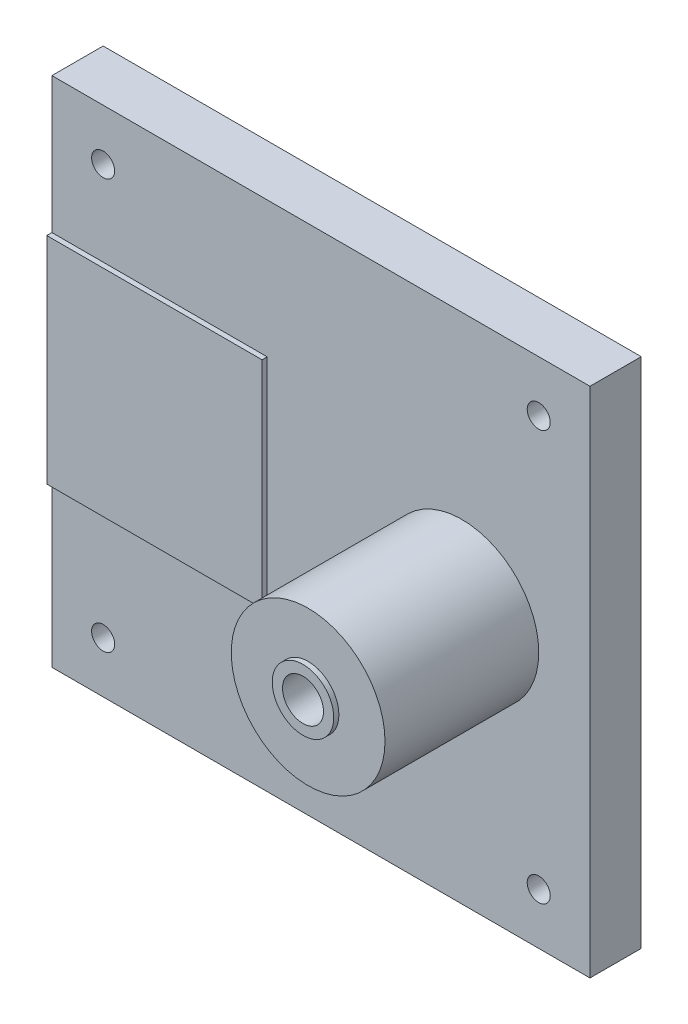
ISO-10303-21;
HEADER;
FILE_DESCRIPTION(('STEP AP214'),'2;1');
FILE_NAME('part.step','',(''),(''),'','','');
FILE_SCHEMA(('AUTOMOTIVE_DESIGN { 1 0 10303 214 1 1 1 1 }'));
ENDSEC;
DATA;
#1=APPLICATION_CONTEXT('core data for automotive mechanical design processes');
#2=APPLICATION_PROTOCOL_DEFINITION('international standard','automotive_design',2000,#1);
#3=PRODUCT_CONTEXT('',#1,'mechanical');
#4=PRODUCT('Part','Part','',(#3));
#5=PRODUCT_RELATED_PRODUCT_CATEGORY('part','',(#4));
#6=PRODUCT_DEFINITION_FORMATION('','',#4);
#7=PRODUCT_DEFINITION_CONTEXT('part definition',#1,'design');
#8=PRODUCT_DEFINITION('design','',#6,#7);
#9=PRODUCT_DEFINITION_SHAPE('','',#8);
#10=(LENGTH_UNIT() NAMED_UNIT(*) SI_UNIT(.MILLI.,.METRE.));
#11=(NAMED_UNIT(*) PLANE_ANGLE_UNIT() SI_UNIT($,.RADIAN.));
#12=(NAMED_UNIT(*) SI_UNIT($,.STERADIAN.) SOLID_ANGLE_UNIT());
#13=UNCERTAINTY_MEASURE_WITH_UNIT(LENGTH_MEASURE(1.E-05),#10,'distance_accuracy_value','');
#14=(GEOMETRIC_REPRESENTATION_CONTEXT(3) GLOBAL_UNCERTAINTY_ASSIGNED_CONTEXT((#13)) GLOBAL_UNIT_ASSIGNED_CONTEXT((#10,
#11,#12)) REPRESENTATION_CONTEXT('',''));
#15=CARTESIAN_POINT('',(0.,0.,0.));
#16=DIRECTION('',(0.,0.,1.));
#17=DIRECTION('',(1.,0.,0.));
#18=AXIS2_PLACEMENT_3D('',#15,#16,#17);
#19=CARTESIAN_POINT('',(0.,0.,40.));
#20=DIRECTION('',(0.,0.,1.));
#21=DIRECTION('',(1.,0.,0.));
#22=AXIS2_PLACEMENT_3D('',#19,#20,#21);
#23=PLANE('',#22);
#24=CARTESIAN_POINT('',(0.,0.,40.));
#25=DIRECTION('',(0.,0.,1.));
#26=DIRECTION('',(1.,0.,0.));
#27=AXIS2_PLACEMENT_3D('',#24,#25,#26);
#28=CIRCLE('',#27,15.);
#29=CARTESIAN_POINT('',(15.,0.,40.));
#30=VERTEX_POINT('',#29);
#31=EDGE_CURVE('E129',#30,#30,#28,.T.);
#32=ORIENTED_EDGE('',*,*,#31,.T.);
#33=EDGE_LOOP('',(#32));
#34=FACE_BOUND('',#33,.T.);
#35=CARTESIAN_POINT('',(0.,0.,40.));
#36=DIRECTION('',(0.,0.,1.));
#37=DIRECTION('',(1.,0.,0.));
#38=AXIS2_PLACEMENT_3D('',#35,#36,#37);
#39=CIRCLE('',#38,6.);
#40=CARTESIAN_POINT('',(6.,0.,40.));
#41=VERTEX_POINT('',#40);
#42=EDGE_CURVE('E214',#41,#41,#39,.T.);
#43=ORIENTED_EDGE('',*,*,#42,.F.);
#44=EDGE_LOOP('',(#43));
#45=FACE_BOUND('',#44,.T.);
#46=ADVANCED_FACE('F33',(#34,#45),#23,.T.);
#47=CARTESIAN_POINT('',(0.,0.,10.));
#48=DIRECTION('',(0.,0.,1.));
#49=DIRECTION('',(1.,0.,0.));
#50=AXIS2_PLACEMENT_3D('',#47,#48,#49);
#51=PLANE('',#50);
#52=CARTESIAN_POINT('',(15.,40.,10.));
#53=DIRECTION('',(0.,0.,1.));
#54=DIRECTION('',(-1.,0.,0.));
#55=AXIS2_PLACEMENT_3D('',#52,#53,#54);
#56=CIRCLE('',#55,2.25);
#57=CARTESIAN_POINT('',(12.75,40.,10.));
#58=VERTEX_POINT('',#57);
#59=EDGE_CURVE('E208',#58,#58,#56,.T.);
#60=ORIENTED_EDGE('',*,*,#59,.F.);
#61=EDGE_LOOP('',(#60));
#62=FACE_BOUND('',#61,.T.);
#63=CARTESIAN_POINT('',(15.,-40.,10.));
#64=DIRECTION('',(0.,0.,1.));
#65=DIRECTION('',(1.,0.,0.));
#66=AXIS2_PLACEMENT_3D('',#63,#64,#65);
#67=CIRCLE('',#66,2.25);
#68=CARTESIAN_POINT('',(17.25,-40.,10.));
#69=VERTEX_POINT('',#68);
#70=EDGE_CURVE('E202',#69,#69,#67,.T.);
#71=ORIENTED_EDGE('',*,*,#70,.F.);
#72=EDGE_LOOP('',(#71));
#73=FACE_BOUND('',#72,.T.);
#74=CARTESIAN_POINT('',(-70.,-40.,10.));
#75=DIRECTION('',(0.,0.,1.));
#76=DIRECTION('',(-1.,0.,0.));
#77=AXIS2_PLACEMENT_3D('',#74,#75,#76);
#78=CIRCLE('',#77,2.25);
#79=CARTESIAN_POINT('',(-72.25,-40.,10.));
#80=VERTEX_POINT('',#79);
#81=EDGE_CURVE('E196',#80,#80,#78,.T.);
#82=ORIENTED_EDGE('',*,*,#81,.F.);
#83=EDGE_LOOP('',(#82));
#84=FACE_BOUND('',#83,.T.);
#85=CARTESIAN_POINT('',(-70.,40.,10.));
#86=DIRECTION('',(0.,0.,1.));
#87=DIRECTION('',(1.,0.,0.));
#88=AXIS2_PLACEMENT_3D('',#85,#86,#87);
#89=CIRCLE('',#88,2.25);
#90=CARTESIAN_POINT('',(-67.75,40.,10.));
#91=VERTEX_POINT('',#90);
#92=EDGE_CURVE('E179',#91,#91,#89,.T.);
#93=ORIENTED_EDGE('',*,*,#92,.F.);
#94=EDGE_LOOP('',(#93));
#95=FACE_BOUND('',#94,.T.);
#96=CARTESIAN_POINT('',(0.,0.,10.));
#97=DIRECTION('',(0.,0.,1.));
#98=DIRECTION('',(1.,0.,0.));
#99=AXIS2_PLACEMENT_3D('',#96,#97,#98);
#100=CIRCLE('',#99,15.);
#101=CARTESIAN_POINT('',(15.,0.,10.));
#102=VERTEX_POINT('',#101);
#103=EDGE_CURVE('E123',#102,#102,#100,.T.);
#104=ORIENTED_EDGE('',*,*,#103,.F.);
#105=EDGE_LOOP('',(#104));
#106=FACE_BOUND('',#105,.T.);
#107=DIRECTION('',(0.,1.,0.));
#108=VECTOR('',#107,1.);
#109=CARTESIAN_POINT('',(-38.,23.4745176467612,10.));
#110=LINE('',#109,#108);
#111=CARTESIAN_POINT('',(-38.,-18.5254823532388,10.));
#112=VERTEX_POINT('',#111);
#113=CARTESIAN_POINT('',(-38.,23.4745176467612,10.));
#114=VERTEX_POINT('',#113);
#115=EDGE_CURVE('E48',#112,#114,#110,.T.);
#116=ORIENTED_EDGE('',*,*,#115,.F.);
#117=DIRECTION('',(1.,0.,0.));
#118=VECTOR('',#117,1.);
#119=CARTESIAN_POINT('',(-38.,-18.5254823532388,10.));
#120=LINE('',#119,#118);
#121=CARTESIAN_POINT('',(-80.,-18.5254823532388,10.));
#122=VERTEX_POINT('',#121);
#123=EDGE_CURVE('E174',#122,#112,#120,.T.);
#124=ORIENTED_EDGE('',*,*,#123,.F.);
#125=DIRECTION('',(0.,-1.,0.));
#126=VECTOR('',#125,1.);
#127=CARTESIAN_POINT('',(-80.,50.,10.));
#128=LINE('',#127,#126);
#129=CARTESIAN_POINT('',(-80.,-50.,10.));
#130=VERTEX_POINT('',#129);
#131=EDGE_CURVE('E119',#122,#130,#128,.T.);
#132=ORIENTED_EDGE('',*,*,#131,.T.);
#133=DIRECTION('',(1.,0.,0.));
#134=VECTOR('',#133,1.);
#135=CARTESIAN_POINT('',(-80.,-50.,10.));
#136=LINE('',#135,#134);
#137=CARTESIAN_POINT('',(25.,-50.,10.));
#138=VERTEX_POINT('',#137);
#139=EDGE_CURVE('E143',#130,#138,#136,.T.);
#140=ORIENTED_EDGE('',*,*,#139,.T.);
#141=DIRECTION('',(0.,1.,0.));
#142=VECTOR('',#141,1.);
#143=CARTESIAN_POINT('',(25.,50.,10.));
#144=LINE('',#143,#142);
#145=CARTESIAN_POINT('',(25.,50.,10.));
#146=VERTEX_POINT('',#145);
#147=EDGE_CURVE('E135',#138,#146,#144,.T.);
#148=ORIENTED_EDGE('',*,*,#147,.T.);
#149=DIRECTION('',(-1.,0.,0.));
#150=VECTOR('',#149,1.);
#151=CARTESIAN_POINT('',(-80.,50.,10.));
#152=LINE('',#151,#150);
#153=CARTESIAN_POINT('',(-80.,50.,10.));
#154=VERTEX_POINT('',#153);
#155=EDGE_CURVE('E138',#146,#154,#152,.T.);
#156=ORIENTED_EDGE('',*,*,#155,.T.);
#157=CARTESIAN_POINT('',(-80.,23.4745176467612,10.));
#158=VERTEX_POINT('',#157);
#159=EDGE_CURVE('E141',#154,#158,#128,.T.);
#160=ORIENTED_EDGE('',*,*,#159,.T.);
#161=DIRECTION('',(-1.,0.,0.));
#162=VECTOR('',#161,1.);
#163=CARTESIAN_POINT('',(-38.,23.4745176467612,10.));
#164=LINE('',#163,#162);
#165=EDGE_CURVE('E53',#114,#158,#164,.T.);
#166=ORIENTED_EDGE('',*,*,#165,.F.);
#167=EDGE_LOOP('',(#116,#124,#132,#140,#148,#156,#160,#166));
#168=FACE_BOUND('',#167,.T.);
#169=ADVANCED_FACE('F173',(#62,#73,#84,#95,#106,#168),#51,.T.);
#170=CARTESIAN_POINT('',(25.,50.,10.));
#171=DIRECTION('',(-1.,0.,0.));
#172=DIRECTION('',(0.,-1.,0.));
#173=AXIS2_PLACEMENT_3D('',#170,#171,#172);
#174=PLANE('',#173);
#175=DIRECTION('',(0.,1.,0.));
#176=VECTOR('',#175,1.);
#177=CARTESIAN_POINT('',(25.,50.,0.));
#178=LINE('',#177,#176);
#179=CARTESIAN_POINT('',(25.,-50.,0.));
#180=VERTEX_POINT('',#179);
#181=CARTESIAN_POINT('',(25.,50.,0.));
#182=VERTEX_POINT('',#181);
#183=EDGE_CURVE('E132',#180,#182,#178,.T.);
#184=ORIENTED_EDGE('',*,*,#183,.T.);
#185=DIRECTION('',(0.,0.,-1.));
#186=VECTOR('',#185,1.);
#187=CARTESIAN_POINT('',(25.,50.,10.));
#188=LINE('',#187,#186);
#189=EDGE_CURVE('E11',#146,#182,#188,.T.);
#190=ORIENTED_EDGE('',*,*,#189,.F.);
#191=ORIENTED_EDGE('',*,*,#147,.F.);
#192=DIRECTION('',(0.,0.,-1.));
#193=VECTOR('',#192,1.);
#194=CARTESIAN_POINT('',(25.,-50.,10.));
#195=LINE('',#194,#193);
#196=EDGE_CURVE('E145',#138,#180,#195,.T.);
#197=ORIENTED_EDGE('',*,*,#196,.T.);
#198=EDGE_LOOP('',(#184,#190,#191,#197));
#199=FACE_BOUND('',#198,.T.);
#200=ADVANCED_FACE('F35',(#199),#174,.F.);
#201=CARTESIAN_POINT('',(-80.,50.,10.));
#202=DIRECTION('',(0.,-1.,0.));
#203=DIRECTION('',(1.,0.,0.));
#204=AXIS2_PLACEMENT_3D('',#201,#202,#203);
#205=PLANE('',#204);
#206=DIRECTION('',(-1.,0.,0.));
#207=VECTOR('',#206,1.);
#208=CARTESIAN_POINT('',(-80.,50.,0.));
#209=LINE('',#208,#207);
#210=CARTESIAN_POINT('',(-80.,50.,0.));
#211=VERTEX_POINT('',#210);
#212=EDGE_CURVE('E148',#182,#211,#209,.T.);
#213=ORIENTED_EDGE('',*,*,#212,.T.);
#214=DIRECTION('',(0.,0.,-1.));
#215=VECTOR('',#214,1.);
#216=CARTESIAN_POINT('',(-80.,50.,10.));
#217=LINE('',#216,#215);
#218=EDGE_CURVE('E41',#154,#211,#217,.T.);
#219=ORIENTED_EDGE('',*,*,#218,.F.);
#220=ORIENTED_EDGE('',*,*,#155,.F.);
#221=ORIENTED_EDGE('',*,*,#189,.T.);
#222=EDGE_LOOP('',(#213,#219,#220,#221));
#223=FACE_BOUND('',#222,.T.);
#224=ADVANCED_FACE('F263',(#223),#205,.F.);
#225=CARTESIAN_POINT('',(-80.,50.,10.));
#226=DIRECTION('',(1.,0.,0.));
#227=DIRECTION('',(0.,1.,0.));
#228=AXIS2_PLACEMENT_3D('',#225,#226,#227);
#229=PLANE('',#228);
#230=DIRECTION('',(0.,-1.,0.));
#231=VECTOR('',#230,1.);
#232=CARTESIAN_POINT('',(-80.,50.,0.));
#233=LINE('',#232,#231);
#234=CARTESIAN_POINT('',(-80.,-50.,0.));
#235=VERTEX_POINT('',#234);
#236=EDGE_CURVE('E150',#211,#235,#233,.T.);
#237=ORIENTED_EDGE('',*,*,#236,.T.);
#238=DIRECTION('',(0.,0.,-1.));
#239=VECTOR('',#238,1.);
#240=CARTESIAN_POINT('',(-80.,-50.,10.));
#241=LINE('',#240,#239);
#242=EDGE_CURVE('E155',#130,#235,#241,.T.);
#243=ORIENTED_EDGE('',*,*,#242,.F.);
#244=ORIENTED_EDGE('',*,*,#131,.F.);
#245=DIRECTION('',(0.,0.,-1.));
#246=VECTOR('',#245,1.);
#247=CARTESIAN_POINT('',(-80.,-18.5254823532388,11.));
#248=LINE('',#247,#246);
#249=CARTESIAN_POINT('',(-80.,-18.5254823532388,11.));
#250=VERTEX_POINT('',#249);
#251=EDGE_CURVE('E101',#250,#122,#248,.T.);
#252=ORIENTED_EDGE('',*,*,#251,.F.);
#253=DIRECTION('',(0.,-1.,0.));
#254=VECTOR('',#253,1.);
#255=CARTESIAN_POINT('',(-80.,23.4745176467612,11.));
#256=LINE('',#255,#254);
#257=CARTESIAN_POINT('',(-80.,23.4745176467612,11.));
#258=VERTEX_POINT('',#257);
#259=EDGE_CURVE('E107',#258,#250,#256,.T.);
#260=ORIENTED_EDGE('',*,*,#259,.F.);
#261=DIRECTION('',(0.,0.,-1.));
#262=VECTOR('',#261,1.);
#263=CARTESIAN_POINT('',(-80.,23.4745176467612,11.));
#264=LINE('',#263,#262);
#265=EDGE_CURVE('E185',#258,#158,#264,.T.);
#266=ORIENTED_EDGE('',*,*,#265,.T.);
#267=ORIENTED_EDGE('',*,*,#159,.F.);
#268=ORIENTED_EDGE('',*,*,#218,.T.);
#269=EDGE_LOOP('',(#237,#243,#244,#252,#260,#266,#267,#268));
#270=FACE_BOUND('',#269,.T.);
#271=ADVANCED_FACE('F117',(#270),#229,.F.);
#272=CARTESIAN_POINT('',(-80.,-50.,10.));
#273=DIRECTION('',(0.,1.,0.));
#274=DIRECTION('',(-1.,0.,0.));
#275=AXIS2_PLACEMENT_3D('',#272,#273,#274);
#276=PLANE('',#275);
#277=DIRECTION('',(1.,0.,0.));
#278=VECTOR('',#277,1.);
#279=CARTESIAN_POINT('',(-80.,-50.,0.));
#280=LINE('',#279,#278);
#281=EDGE_CURVE('E139',#235,#180,#280,.T.);
#282=ORIENTED_EDGE('',*,*,#281,.T.);
#283=ORIENTED_EDGE('',*,*,#196,.F.);
#284=ORIENTED_EDGE('',*,*,#139,.F.);
#285=ORIENTED_EDGE('',*,*,#242,.T.);
#286=EDGE_LOOP('',(#282,#283,#284,#285));
#287=FACE_BOUND('',#286,.T.);
#288=ADVANCED_FACE('F168',(#287),#276,.F.);
#289=CARTESIAN_POINT('',(0.,0.,0.));
#290=DIRECTION('',(0.,0.,1.));
#291=DIRECTION('',(1.,0.,0.));
#292=AXIS2_PLACEMENT_3D('',#289,#290,#291);
#293=PLANE('',#292);
#294=CARTESIAN_POINT('',(15.,40.,0.));
#295=DIRECTION('',(0.,0.,1.));
#296=DIRECTION('',(-1.,0.,0.));
#297=AXIS2_PLACEMENT_3D('',#294,#295,#296);
#298=CIRCLE('',#297,2.25);
#299=CARTESIAN_POINT('',(12.75,40.,0.));
#300=VERTEX_POINT('',#299);
#301=EDGE_CURVE('E205',#300,#300,#298,.T.);
#302=ORIENTED_EDGE('',*,*,#301,.T.);
#303=EDGE_LOOP('',(#302));
#304=FACE_BOUND('',#303,.T.);
#305=CARTESIAN_POINT('',(15.,-40.,0.));
#306=DIRECTION('',(0.,0.,1.));
#307=DIRECTION('',(1.,0.,0.));
#308=AXIS2_PLACEMENT_3D('',#305,#306,#307);
#309=CIRCLE('',#308,2.25);
#310=CARTESIAN_POINT('',(17.25,-40.,0.));
#311=VERTEX_POINT('',#310);
#312=EDGE_CURVE('E199',#311,#311,#309,.T.);
#313=ORIENTED_EDGE('',*,*,#312,.T.);
#314=EDGE_LOOP('',(#313));
#315=FACE_BOUND('',#314,.T.);
#316=CARTESIAN_POINT('',(-70.,-40.,0.));
#317=DIRECTION('',(0.,0.,1.));
#318=DIRECTION('',(-1.,0.,0.));
#319=AXIS2_PLACEMENT_3D('',#316,#317,#318);
#320=CIRCLE('',#319,2.25);
#321=CARTESIAN_POINT('',(-72.25,-40.,0.));
#322=VERTEX_POINT('',#321);
#323=EDGE_CURVE('E194',#322,#322,#320,.T.);
#324=ORIENTED_EDGE('',*,*,#323,.T.);
#325=EDGE_LOOP('',(#324));
#326=FACE_BOUND('',#325,.T.);
#327=CARTESIAN_POINT('',(-70.,40.,0.));
#328=DIRECTION('',(0.,0.,1.));
#329=DIRECTION('',(1.,0.,0.));
#330=AXIS2_PLACEMENT_3D('',#327,#328,#329);
#331=CIRCLE('',#330,2.25);
#332=CARTESIAN_POINT('',(-67.75,40.,0.));
#333=VERTEX_POINT('',#332);
#334=EDGE_CURVE('E175',#333,#333,#331,.T.);
#335=ORIENTED_EDGE('',*,*,#334,.T.);
#336=EDGE_LOOP('',(#335));
#337=FACE_BOUND('',#336,.T.);
#338=ORIENTED_EDGE('',*,*,#183,.F.);
#339=ORIENTED_EDGE('',*,*,#281,.F.);
#340=ORIENTED_EDGE('',*,*,#236,.F.);
#341=ORIENTED_EDGE('',*,*,#212,.F.);
#342=EDGE_LOOP('',(#338,#339,#340,#341));
#343=FACE_BOUND('',#342,.T.);
#344=ADVANCED_FACE('F165',(#304,#315,#326,#337,#343),#293,.F.);
#345=CARTESIAN_POINT('',(0.,0.,40.));
#346=DIRECTION('',(0.,0.,-1.));
#347=DIRECTION('',(-1.,0.,0.));
#348=AXIS2_PLACEMENT_3D('',#345,#346,#347);
#349=CYLINDRICAL_SURFACE('',#348,15.);
#350=ORIENTED_EDGE('',*,*,#31,.F.);
#351=EDGE_LOOP('',(#350));
#352=FACE_BOUND('',#351,.T.);
#353=ORIENTED_EDGE('',*,*,#103,.T.);
#354=EDGE_LOOP('',(#353));
#355=FACE_BOUND('',#354,.T.);
#356=ADVANCED_FACE('F253',(#352,#355),#349,.T.);
#357=CARTESIAN_POINT('',(-38.,-18.5254823532388,11.));
#358=DIRECTION('',(0.,1.,0.));
#359=DIRECTION('',(0.,0.,1.));
#360=AXIS2_PLACEMENT_3D('',#357,#358,#359);
#361=PLANE('',#360);
#362=ORIENTED_EDGE('',*,*,#123,.T.);
#363=DIRECTION('',(0.,0.,-1.));
#364=VECTOR('',#363,1.);
#365=CARTESIAN_POINT('',(-38.,-18.5254823532388,11.));
#366=LINE('',#365,#364);
#367=CARTESIAN_POINT('',(-38.,-18.5254823532388,11.));
#368=VERTEX_POINT('',#367);
#369=EDGE_CURVE('E103',#368,#112,#366,.T.);
#370=ORIENTED_EDGE('',*,*,#369,.F.);
#371=DIRECTION('',(1.,0.,0.));
#372=VECTOR('',#371,1.);
#373=CARTESIAN_POINT('',(-38.,-18.5254823532388,11.));
#374=LINE('',#373,#372);
#375=EDGE_CURVE('E97',#250,#368,#374,.T.);
#376=ORIENTED_EDGE('',*,*,#375,.F.);
#377=ORIENTED_EDGE('',*,*,#251,.T.);
#378=EDGE_LOOP('',(#362,#370,#376,#377));
#379=FACE_BOUND('',#378,.T.);
#380=ADVANCED_FACE('F99',(#379),#361,.F.);
#381=CARTESIAN_POINT('',(-38.,23.4745176467612,11.));
#382=DIRECTION('',(-1.,0.,0.));
#383=DIRECTION('',(0.,-1.,0.));
#384=AXIS2_PLACEMENT_3D('',#381,#382,#383);
#385=PLANE('',#384);
#386=ORIENTED_EDGE('',*,*,#115,.T.);
#387=DIRECTION('',(0.,0.,-1.));
#388=VECTOR('',#387,1.);
#389=CARTESIAN_POINT('',(-38.,23.4745176467612,11.));
#390=LINE('',#389,#388);
#391=CARTESIAN_POINT('',(-38.,23.4745176467612,11.));
#392=VERTEX_POINT('',#391);
#393=EDGE_CURVE('E125',#392,#114,#390,.T.);
#394=ORIENTED_EDGE('',*,*,#393,.F.);
#395=DIRECTION('',(0.,1.,0.));
#396=VECTOR('',#395,1.);
#397=CARTESIAN_POINT('',(-38.,23.4745176467612,11.));
#398=LINE('',#397,#396);
#399=EDGE_CURVE('E106',#368,#392,#398,.T.);
#400=ORIENTED_EDGE('',*,*,#399,.F.);
#401=ORIENTED_EDGE('',*,*,#369,.T.);
#402=EDGE_LOOP('',(#386,#394,#400,#401));
#403=FACE_BOUND('',#402,.T.);
#404=ADVANCED_FACE('F191',(#403),#385,.F.);
#405=CARTESIAN_POINT('',(-38.,23.4745176467612,11.));
#406=DIRECTION('',(0.,-1.,0.));
#407=DIRECTION('',(1.,0.,0.));
#408=AXIS2_PLACEMENT_3D('',#405,#406,#407);
#409=PLANE('',#408);
#410=ORIENTED_EDGE('',*,*,#165,.T.);
#411=ORIENTED_EDGE('',*,*,#265,.F.);
#412=DIRECTION('',(-1.,0.,0.));
#413=VECTOR('',#412,1.);
#414=CARTESIAN_POINT('',(-38.,23.4745176467612,11.));
#415=LINE('',#414,#413);
#416=EDGE_CURVE('E112',#392,#258,#415,.T.);
#417=ORIENTED_EDGE('',*,*,#416,.F.);
#418=ORIENTED_EDGE('',*,*,#393,.T.);
#419=EDGE_LOOP('',(#410,#411,#417,#418));
#420=FACE_BOUND('',#419,.T.);
#421=ADVANCED_FACE('F189',(#420),#409,.F.);
#422=CARTESIAN_POINT('',(0.,0.,11.));
#423=DIRECTION('',(0.,0.,-1.));
#424=DIRECTION('',(-1.,0.,0.));
#425=AXIS2_PLACEMENT_3D('',#422,#423,#424);
#426=PLANE('',#425);
#427=ORIENTED_EDGE('',*,*,#259,.T.);
#428=ORIENTED_EDGE('',*,*,#375,.T.);
#429=ORIENTED_EDGE('',*,*,#399,.T.);
#430=ORIENTED_EDGE('',*,*,#416,.T.);
#431=EDGE_LOOP('',(#427,#428,#429,#430));
#432=FACE_BOUND('',#431,.T.);
#433=ADVANCED_FACE('F110',(#432),#426,.F.);
#434=CARTESIAN_POINT('',(-70.,40.,0.));
#435=DIRECTION('',(0.,0.,1.));
#436=DIRECTION('',(1.,0.,0.));
#437=AXIS2_PLACEMENT_3D('',#434,#435,#436);
#438=CYLINDRICAL_SURFACE('',#437,2.25);
#439=ORIENTED_EDGE('',*,*,#334,.F.);
#440=EDGE_LOOP('',(#439));
#441=FACE_BOUND('',#440,.T.);
#442=ORIENTED_EDGE('',*,*,#92,.T.);
#443=EDGE_LOOP('',(#442));
#444=FACE_BOUND('',#443,.T.);
#445=ADVANCED_FACE('F294',(#441,#444),#438,.F.);
#446=CARTESIAN_POINT('',(-70.,-40.,0.));
#447=DIRECTION('',(0.,0.,1.));
#448=DIRECTION('',(1.,0.,0.));
#449=AXIS2_PLACEMENT_3D('',#446,#447,#448);
#450=CYLINDRICAL_SURFACE('',#449,2.25);
#451=ORIENTED_EDGE('',*,*,#323,.F.);
#452=EDGE_LOOP('',(#451));
#453=FACE_BOUND('',#452,.T.);
#454=ORIENTED_EDGE('',*,*,#81,.T.);
#455=EDGE_LOOP('',(#454));
#456=FACE_BOUND('',#455,.T.);
#457=ADVANCED_FACE('F299',(#453,#456),#450,.F.);
#458=CARTESIAN_POINT('',(15.,-40.,0.));
#459=DIRECTION('',(0.,0.,1.));
#460=DIRECTION('',(1.,0.,0.));
#461=AXIS2_PLACEMENT_3D('',#458,#459,#460);
#462=CYLINDRICAL_SURFACE('',#461,2.25);
#463=ORIENTED_EDGE('',*,*,#312,.F.);
#464=EDGE_LOOP('',(#463));
#465=FACE_BOUND('',#464,.T.);
#466=ORIENTED_EDGE('',*,*,#70,.T.);
#467=EDGE_LOOP('',(#466));
#468=FACE_BOUND('',#467,.T.);
#469=ADVANCED_FACE('F238',(#465,#468),#462,.F.);
#470=CARTESIAN_POINT('',(15.,40.,0.));
#471=DIRECTION('',(0.,0.,1.));
#472=DIRECTION('',(1.,0.,0.));
#473=AXIS2_PLACEMENT_3D('',#470,#471,#472);
#474=CYLINDRICAL_SURFACE('',#473,2.25);
#475=ORIENTED_EDGE('',*,*,#301,.F.);
#476=EDGE_LOOP('',(#475));
#477=FACE_BOUND('',#476,.T.);
#478=ORIENTED_EDGE('',*,*,#59,.T.);
#479=EDGE_LOOP('',(#478));
#480=FACE_BOUND('',#479,.T.);
#481=ADVANCED_FACE('F228',(#477,#480),#474,.F.);
#482=CARTESIAN_POINT('',(0.,0.,41.));
#483=DIRECTION('',(0.,0.,1.));
#484=DIRECTION('',(1.,0.,0.));
#485=AXIS2_PLACEMENT_3D('',#482,#483,#484);
#486=PLANE('',#485);
#487=CARTESIAN_POINT('',(0.,0.,41.));
#488=DIRECTION('',(0.,0.,1.));
#489=DIRECTION('',(1.,0.,0.));
#490=AXIS2_PLACEMENT_3D('',#487,#488,#489);
#491=CIRCLE('',#490,6.);
#492=CARTESIAN_POINT('',(6.,0.,41.));
#493=VERTEX_POINT('',#492);
#494=EDGE_CURVE('E211',#493,#493,#491,.T.);
#495=ORIENTED_EDGE('',*,*,#494,.T.);
#496=EDGE_LOOP('',(#495));
#497=FACE_BOUND('',#496,.T.);
#498=CARTESIAN_POINT('',(0.,0.,41.));
#499=DIRECTION('',(0.,0.,1.));
#500=DIRECTION('',(1.,0.,0.));
#501=AXIS2_PLACEMENT_3D('',#498,#499,#500);
#502=CIRCLE('',#501,4.);
#503=CARTESIAN_POINT('',(4.,0.,41.));
#504=VERTEX_POINT('',#503);
#505=EDGE_CURVE('E217',#504,#504,#502,.T.);
#506=ORIENTED_EDGE('',*,*,#505,.F.);
#507=EDGE_LOOP('',(#506));
#508=FACE_BOUND('',#507,.T.);
#509=ADVANCED_FACE('F225',(#497,#508),#486,.T.);
#510=CARTESIAN_POINT('',(0.,0.,41.));
#511=DIRECTION('',(0.,0.,-1.));
#512=DIRECTION('',(-1.,0.,0.));
#513=AXIS2_PLACEMENT_3D('',#510,#511,#512);
#514=CYLINDRICAL_SURFACE('',#513,6.);
#515=ORIENTED_EDGE('',*,*,#494,.F.);
#516=EDGE_LOOP('',(#515));
#517=FACE_BOUND('',#516,.T.);
#518=ORIENTED_EDGE('',*,*,#42,.T.);
#519=EDGE_LOOP('',(#518));
#520=FACE_BOUND('',#519,.T.);
#521=ADVANCED_FACE('F227',(#517,#520),#514,.T.);
#522=CARTESIAN_POINT('',(0.,0.,10.));
#523=DIRECTION('',(0.,0.,1.));
#524=DIRECTION('',(1.,0.,0.));
#525=AXIS2_PLACEMENT_3D('',#522,#523,#524);
#526=PLANE('',#525);
#527=CARTESIAN_POINT('',(0.,0.,10.));
#528=DIRECTION('',(0.,0.,1.));
#529=DIRECTION('',(1.,0.,0.));
#530=AXIS2_PLACEMENT_3D('',#527,#528,#529);
#531=CIRCLE('',#530,4.);
#532=CARTESIAN_POINT('',(4.,0.,10.));
#533=VERTEX_POINT('',#532);
#534=EDGE_CURVE('E120',#533,#533,#531,.T.);
#535=ORIENTED_EDGE('',*,*,#534,.T.);
#536=EDGE_LOOP('',(#535));
#537=FACE_BOUND('',#536,.T.);
#538=ADVANCED_FACE('F235',(#537),#526,.T.);
#539=CARTESIAN_POINT('',(0.,0.,10.));
#540=DIRECTION('',(0.,0.,1.));
#541=DIRECTION('',(1.,0.,0.));
#542=AXIS2_PLACEMENT_3D('',#539,#540,#541);
#543=CYLINDRICAL_SURFACE('',#542,4.);
#544=ORIENTED_EDGE('',*,*,#534,.F.);
#545=EDGE_LOOP('',(#544));
#546=FACE_BOUND('',#545,.T.);
#547=ORIENTED_EDGE('',*,*,#505,.T.);
#548=EDGE_LOOP('',(#547));
#549=FACE_BOUND('',#548,.T.);
#550=ADVANCED_FACE('F223',(#546,#549),#543,.F.);
#551=CLOSED_SHELL('',(#46,#169,#200,#224,#271,#288,#344,#356,#380,#404,#421,#433,#445,#457,#469,
#481,#509,#521,#538,#550));
#552=MANIFOLD_SOLID_BREP('B2',#551);
#553=ADVANCED_BREP_SHAPE_REPRESENTATION('',(#18,#552),#14);
#554=SHAPE_DEFINITION_REPRESENTATION(#9,#553);
ENDSEC;
END-ISO-10303-21;
